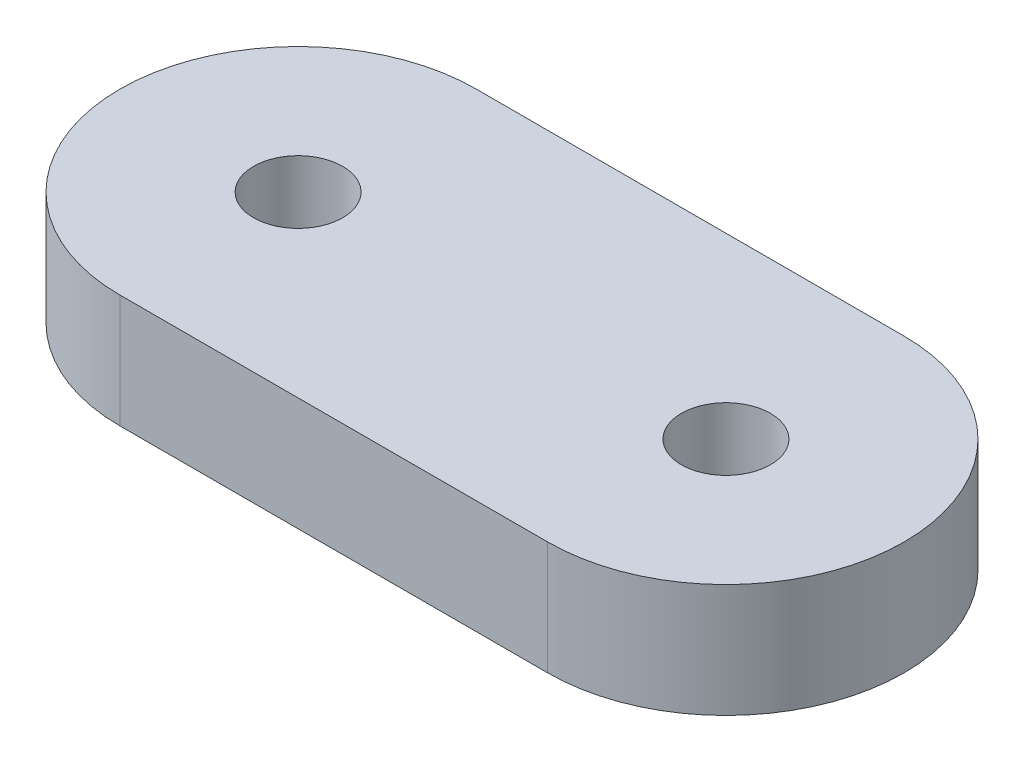
ISO-10303-21;
HEADER;
FILE_DESCRIPTION(('STEP AP214'),'2;1');
FILE_NAME('part.step','',(''),(''),'','','');
FILE_SCHEMA(('AUTOMOTIVE_DESIGN { 1 0 10303 214 1 1 1 1 }'));
ENDSEC;
DATA;
#1=APPLICATION_CONTEXT('core data for automotive mechanical design processes');
#2=APPLICATION_PROTOCOL_DEFINITION('international standard','automotive_design',2000,#1);
#3=PRODUCT_CONTEXT('',#1,'mechanical');
#4=PRODUCT('Part','Part','',(#3));
#5=PRODUCT_RELATED_PRODUCT_CATEGORY('part','',(#4));
#6=PRODUCT_DEFINITION_FORMATION('','',#4);
#7=PRODUCT_DEFINITION_CONTEXT('part definition',#1,'design');
#8=PRODUCT_DEFINITION('design','',#6,#7);
#9=PRODUCT_DEFINITION_SHAPE('','',#8);
#10=(LENGTH_UNIT() NAMED_UNIT(*) SI_UNIT(.MILLI.,.METRE.));
#11=(NAMED_UNIT(*) PLANE_ANGLE_UNIT() SI_UNIT($,.RADIAN.));
#12=(NAMED_UNIT(*) SI_UNIT($,.STERADIAN.) SOLID_ANGLE_UNIT());
#13=UNCERTAINTY_MEASURE_WITH_UNIT(LENGTH_MEASURE(1.E-05),#10,'distance_accuracy_value','');
#14=(GEOMETRIC_REPRESENTATION_CONTEXT(3) GLOBAL_UNCERTAINTY_ASSIGNED_CONTEXT((#13)) GLOBAL_UNIT_ASSIGNED_CONTEXT((#10,
#11,#12)) REPRESENTATION_CONTEXT('',''));
#15=CARTESIAN_POINT('',(0.,0.,0.));
#16=DIRECTION('',(0.,0.,1.));
#17=DIRECTION('',(1.,0.,0.));
#18=AXIS2_PLACEMENT_3D('',#15,#16,#17);
#19=CARTESIAN_POINT('',(0.,3.18,0.));
#20=DIRECTION('',(0.,1.,0.));
#21=DIRECTION('',(0.,0.,1.));
#22=AXIS2_PLACEMENT_3D('',#19,#20,#21);
#23=PLANE('',#22);
#24=CARTESIAN_POINT('',(0.,3.18,0.));
#25=DIRECTION('',(0.,1.,0.));
#26=DIRECTION('',(0.,0.,1.));
#27=AXIS2_PLACEMENT_3D('',#24,#25,#26);
#28=CIRCLE('',#27,1.25);
#29=CARTESIAN_POINT('',(0.,3.18,-1.25));
#30=VERTEX_POINT('',#29);
#31=EDGE_CURVE('E100',#30,#30,#28,.T.);
#32=ORIENTED_EDGE('',*,*,#31,.F.);
#33=EDGE_LOOP('',(#32));
#34=FACE_BOUND('',#33,.T.);
#35=CARTESIAN_POINT('',(0.,3.18,0.));
#36=DIRECTION('',(0.,1.,0.));
#37=DIRECTION('',(0.,0.,1.));
#38=AXIS2_PLACEMENT_3D('',#35,#36,#37);
#39=CIRCLE('',#38,5.);
#40=CARTESIAN_POINT('',(0.,3.18,-5.));
#41=VERTEX_POINT('',#40);
#42=CARTESIAN_POINT('',(0.,3.18,5.));
#43=VERTEX_POINT('',#42);
#44=EDGE_CURVE('E85',#41,#43,#39,.T.);
#45=ORIENTED_EDGE('',*,*,#44,.T.);
#46=DIRECTION('',(1.,0.,0.));
#47=VECTOR('',#46,1.);
#48=CARTESIAN_POINT('',(0.,3.18,5.));
#49=LINE('',#48,#47);
#50=CARTESIAN_POINT('',(12.,3.18,5.));
#51=VERTEX_POINT('',#50);
#52=EDGE_CURVE('E80',#43,#51,#49,.T.);
#53=ORIENTED_EDGE('',*,*,#52,.T.);
#54=CARTESIAN_POINT('',(12.,3.18,0.));
#55=DIRECTION('',(0.,1.,0.));
#56=DIRECTION('',(0.,0.,1.));
#57=AXIS2_PLACEMENT_3D('',#54,#55,#56);
#58=CIRCLE('',#57,5.);
#59=CARTESIAN_POINT('',(12.,3.18,-5.));
#60=VERTEX_POINT('',#59);
#61=EDGE_CURVE('E83',#51,#60,#58,.T.);
#62=ORIENTED_EDGE('',*,*,#61,.T.);
#63=DIRECTION('',(-1.,0.,0.));
#64=VECTOR('',#63,1.);
#65=CARTESIAN_POINT('',(0.,3.18,-5.));
#66=LINE('',#65,#64);
#67=EDGE_CURVE('E50',#60,#41,#66,.T.);
#68=ORIENTED_EDGE('',*,*,#67,.T.);
#69=EDGE_LOOP('',(#45,#53,#62,#68));
#70=FACE_BOUND('',#69,.T.);
#71=CARTESIAN_POINT('',(12.,3.18,0.));
#72=DIRECTION('',(0.,1.,0.));
#73=DIRECTION('',(0.,0.,1.));
#74=AXIS2_PLACEMENT_3D('',#71,#72,#73);
#75=CIRCLE('',#74,1.25);
#76=CARTESIAN_POINT('',(12.,3.18,-1.25));
#77=VERTEX_POINT('',#76);
#78=EDGE_CURVE('E115',#77,#77,#75,.T.);
#79=ORIENTED_EDGE('',*,*,#78,.F.);
#80=EDGE_LOOP('',(#79));
#81=FACE_BOUND('',#80,.T.);
#82=ADVANCED_FACE('F33',(#34,#70,#81),#23,.T.);
#83=CARTESIAN_POINT('',(0.,0.,0.));
#84=DIRECTION('',(0.,1.,0.));
#85=DIRECTION('',(0.,0.,1.));
#86=AXIS2_PLACEMENT_3D('',#83,#84,#85);
#87=PLANE('',#86);
#88=CARTESIAN_POINT('',(0.,0.,0.));
#89=DIRECTION('',(0.,1.,0.));
#90=DIRECTION('',(0.,0.,1.));
#91=AXIS2_PLACEMENT_3D('',#88,#89,#90);
#92=CIRCLE('',#91,5.);
#93=CARTESIAN_POINT('',(0.,0.,-5.));
#94=VERTEX_POINT('',#93);
#95=CARTESIAN_POINT('',(0.,0.,5.));
#96=VERTEX_POINT('',#95);
#97=EDGE_CURVE('E97',#94,#96,#92,.T.);
#98=ORIENTED_EDGE('',*,*,#97,.F.);
#99=DIRECTION('',(-1.,0.,0.));
#100=VECTOR('',#99,1.);
#101=CARTESIAN_POINT('',(0.,0.,-5.));
#102=LINE('',#101,#100);
#103=CARTESIAN_POINT('',(12.,0.,-5.));
#104=VERTEX_POINT('',#103);
#105=EDGE_CURVE('E73',#104,#94,#102,.T.);
#106=ORIENTED_EDGE('',*,*,#105,.F.);
#107=CARTESIAN_POINT('',(12.,0.,0.));
#108=DIRECTION('',(0.,1.,0.));
#109=DIRECTION('',(0.,0.,1.));
#110=AXIS2_PLACEMENT_3D('',#107,#108,#109);
#111=CIRCLE('',#110,5.);
#112=CARTESIAN_POINT('',(12.,0.,5.));
#113=VERTEX_POINT('',#112);
#114=EDGE_CURVE('E67',#113,#104,#111,.T.);
#115=ORIENTED_EDGE('',*,*,#114,.F.);
#116=DIRECTION('',(1.,0.,0.));
#117=VECTOR('',#116,1.);
#118=CARTESIAN_POINT('',(0.,0.,5.));
#119=LINE('',#118,#117);
#120=EDGE_CURVE('E89',#96,#113,#119,.T.);
#121=ORIENTED_EDGE('',*,*,#120,.F.);
#122=EDGE_LOOP('',(#98,#106,#115,#121));
#123=FACE_BOUND('',#122,.T.);
#124=CARTESIAN_POINT('',(0.,0.,0.));
#125=DIRECTION('',(0.,1.,0.));
#126=DIRECTION('',(0.,0.,1.));
#127=AXIS2_PLACEMENT_3D('',#124,#125,#126);
#128=CIRCLE('',#127,1.25);
#129=CARTESIAN_POINT('',(0.,0.,-1.25));
#130=VERTEX_POINT('',#129);
#131=EDGE_CURVE('E112',#130,#130,#128,.T.);
#132=ORIENTED_EDGE('',*,*,#131,.T.);
#133=EDGE_LOOP('',(#132));
#134=FACE_BOUND('',#133,.T.);
#135=CARTESIAN_POINT('',(12.,0.,0.));
#136=DIRECTION('',(0.,1.,0.));
#137=DIRECTION('',(0.,0.,1.));
#138=AXIS2_PLACEMENT_3D('',#135,#136,#137);
#139=CIRCLE('',#138,1.25);
#140=CARTESIAN_POINT('',(12.,0.,-1.25));
#141=VERTEX_POINT('',#140);
#142=EDGE_CURVE('E118',#141,#141,#139,.T.);
#143=ORIENTED_EDGE('',*,*,#142,.T.);
#144=EDGE_LOOP('',(#143));
#145=FACE_BOUND('',#144,.T.);
#146=ADVANCED_FACE('F108',(#123,#134,#145),#87,.F.);
#147=CARTESIAN_POINT('',(0.,3.18,0.));
#148=DIRECTION('',(0.,-1.,0.));
#149=DIRECTION('',(0.,0.,-1.));
#150=AXIS2_PLACEMENT_3D('',#147,#148,#149);
#151=CYLINDRICAL_SURFACE('',#150,5.);
#152=ORIENTED_EDGE('',*,*,#97,.T.);
#153=DIRECTION('',(0.,-1.,0.));
#154=VECTOR('',#153,1.);
#155=CARTESIAN_POINT('',(0.,3.18,5.));
#156=LINE('',#155,#154);
#157=EDGE_CURVE('E11',#43,#96,#156,.T.);
#158=ORIENTED_EDGE('',*,*,#157,.F.);
#159=ORIENTED_EDGE('',*,*,#44,.F.);
#160=DIRECTION('',(0.,-1.,0.));
#161=VECTOR('',#160,1.);
#162=CARTESIAN_POINT('',(0.,3.18,-5.));
#163=LINE('',#162,#161);
#164=EDGE_CURVE('E93',#41,#94,#163,.T.);
#165=ORIENTED_EDGE('',*,*,#164,.T.);
#166=EDGE_LOOP('',(#152,#158,#159,#165));
#167=FACE_BOUND('',#166,.T.);
#168=ADVANCED_FACE('F35',(#167),#151,.T.);
#169=CARTESIAN_POINT('',(0.,3.18,5.));
#170=DIRECTION('',(0.,0.,-1.));
#171=DIRECTION('',(-1.,0.,0.));
#172=AXIS2_PLACEMENT_3D('',#169,#170,#171);
#173=PLANE('',#172);
#174=ORIENTED_EDGE('',*,*,#120,.T.);
#175=DIRECTION('',(0.,-1.,0.));
#176=VECTOR('',#175,1.);
#177=CARTESIAN_POINT('',(12.,3.18,5.));
#178=LINE('',#177,#176);
#179=EDGE_CURVE('E42',#51,#113,#178,.T.);
#180=ORIENTED_EDGE('',*,*,#179,.F.);
#181=ORIENTED_EDGE('',*,*,#52,.F.);
#182=ORIENTED_EDGE('',*,*,#157,.T.);
#183=EDGE_LOOP('',(#174,#180,#181,#182));
#184=FACE_BOUND('',#183,.T.);
#185=ADVANCED_FACE('F88',(#184),#173,.F.);
#186=CARTESIAN_POINT('',(12.,3.18,0.));
#187=DIRECTION('',(0.,-1.,0.));
#188=DIRECTION('',(0.,0.,-1.));
#189=AXIS2_PLACEMENT_3D('',#186,#187,#188);
#190=CYLINDRICAL_SURFACE('',#189,5.);
#191=ORIENTED_EDGE('',*,*,#114,.T.);
#192=DIRECTION('',(0.,-1.,0.));
#193=VECTOR('',#192,1.);
#194=CARTESIAN_POINT('',(12.,3.18,-5.));
#195=LINE('',#194,#193);
#196=EDGE_CURVE('E90',#60,#104,#195,.T.);
#197=ORIENTED_EDGE('',*,*,#196,.F.);
#198=ORIENTED_EDGE('',*,*,#61,.F.);
#199=ORIENTED_EDGE('',*,*,#179,.T.);
#200=EDGE_LOOP('',(#191,#197,#198,#199));
#201=FACE_BOUND('',#200,.T.);
#202=ADVANCED_FACE('F91',(#201),#190,.T.);
#203=CARTESIAN_POINT('',(0.,3.18,-5.));
#204=DIRECTION('',(0.,0.,1.));
#205=DIRECTION('',(1.,0.,0.));
#206=AXIS2_PLACEMENT_3D('',#203,#204,#205);
#207=PLANE('',#206);
#208=ORIENTED_EDGE('',*,*,#105,.T.);
#209=ORIENTED_EDGE('',*,*,#164,.F.);
#210=ORIENTED_EDGE('',*,*,#67,.F.);
#211=ORIENTED_EDGE('',*,*,#196,.T.);
#212=EDGE_LOOP('',(#208,#209,#210,#211));
#213=FACE_BOUND('',#212,.T.);
#214=ADVANCED_FACE('F105',(#213),#207,.F.);
#215=CARTESIAN_POINT('',(0.,3.18,0.));
#216=DIRECTION('',(0.,-1.,0.));
#217=DIRECTION('',(0.,0.,-1.));
#218=AXIS2_PLACEMENT_3D('',#215,#216,#217);
#219=CYLINDRICAL_SURFACE('',#218,1.25);
#220=CARTESIAN_POINT('',(0.,3.18,-1.25));
#221=CARTESIAN_POINT('',(0.,3.146875,-1.25));
#222=CARTESIAN_POINT('',(0.,3.11375,-1.25));
#223=CARTESIAN_POINT('',(0.,3.0475,-1.25));
#224=CARTESIAN_POINT('',(0.,3.014375,-1.25));
#225=CARTESIAN_POINT('',(0.,2.948125,-1.25));
#226=CARTESIAN_POINT('',(0.,2.915,-1.25));
#227=CARTESIAN_POINT('',(0.,2.84875,-1.25));
#228=CARTESIAN_POINT('',(0.,2.815625,-1.25));
#229=CARTESIAN_POINT('',(0.,2.749375,-1.25));
#230=CARTESIAN_POINT('',(0.,2.71625,-1.25));
#231=CARTESIAN_POINT('',(0.,2.65,-1.25));
#232=CARTESIAN_POINT('',(0.,2.616875,-1.25));
#233=CARTESIAN_POINT('',(0.,2.550625,-1.25));
#234=CARTESIAN_POINT('',(0.,2.5175,-1.25));
#235=CARTESIAN_POINT('',(0.,2.45125,-1.25));
#236=CARTESIAN_POINT('',(0.,2.418125,-1.25));
#237=CARTESIAN_POINT('',(0.,2.351875,-1.25));
#238=CARTESIAN_POINT('',(0.,2.31875,-1.25));
#239=CARTESIAN_POINT('',(0.,2.2525,-1.25));
#240=CARTESIAN_POINT('',(0.,2.219375,-1.25));
#241=CARTESIAN_POINT('',(0.,2.153125,-1.25));
#242=CARTESIAN_POINT('',(0.,2.12,-1.25));
#243=CARTESIAN_POINT('',(0.,2.05375,-1.25));
#244=CARTESIAN_POINT('',(0.,2.020625,-1.25));
#245=CARTESIAN_POINT('',(0.,1.954375,-1.25));
#246=CARTESIAN_POINT('',(0.,1.92125,-1.25));
#247=CARTESIAN_POINT('',(0.,1.855,-1.25));
#248=CARTESIAN_POINT('',(0.,1.821875,-1.25));
#249=CARTESIAN_POINT('',(0.,1.755625,-1.25));
#250=CARTESIAN_POINT('',(0.,1.7225,-1.25));
#251=CARTESIAN_POINT('',(0.,1.65625,-1.25));
#252=CARTESIAN_POINT('',(0.,1.623125,-1.25));
#253=CARTESIAN_POINT('',(0.,1.556875,-1.25));
#254=CARTESIAN_POINT('',(0.,1.52375,-1.25));
#255=CARTESIAN_POINT('',(0.,1.4575,-1.25));
#256=CARTESIAN_POINT('',(0.,1.424375,-1.25));
#257=CARTESIAN_POINT('',(0.,1.358125,-1.25));
#258=CARTESIAN_POINT('',(0.,1.325,-1.25));
#259=CARTESIAN_POINT('',(0.,1.25875,-1.25));
#260=CARTESIAN_POINT('',(0.,1.225625,-1.25));
#261=CARTESIAN_POINT('',(0.,1.159375,-1.25));
#262=CARTESIAN_POINT('',(0.,1.12625,-1.25));
#263=CARTESIAN_POINT('',(0.,1.06,-1.25));
#264=CARTESIAN_POINT('',(0.,1.026875,-1.25));
#265=CARTESIAN_POINT('',(0.,0.960625,-1.25));
#266=CARTESIAN_POINT('',(0.,0.9275,-1.25));
#267=CARTESIAN_POINT('',(0.,0.86125,-1.25));
#268=CARTESIAN_POINT('',(0.,0.828125,-1.25));
#269=CARTESIAN_POINT('',(0.,0.761875,-1.25));
#270=CARTESIAN_POINT('',(0.,0.72875,-1.25));
#271=CARTESIAN_POINT('',(0.,0.6625,-1.25));
#272=CARTESIAN_POINT('',(0.,0.629375,-1.25));
#273=CARTESIAN_POINT('',(0.,0.563125,-1.25));
#274=CARTESIAN_POINT('',(0.,0.53,-1.25));
#275=CARTESIAN_POINT('',(0.,0.46375,-1.25));
#276=CARTESIAN_POINT('',(0.,0.430625,-1.25));
#277=CARTESIAN_POINT('',(0.,0.364375,-1.25));
#278=CARTESIAN_POINT('',(0.,0.33125,-1.25));
#279=CARTESIAN_POINT('',(0.,0.265,-1.25));
#280=CARTESIAN_POINT('',(0.,0.231875,-1.25));
#281=CARTESIAN_POINT('',(0.,0.165625,-1.25));
#282=CARTESIAN_POINT('',(0.,0.1325,-1.25));
#283=CARTESIAN_POINT('',(0.,0.06625,-1.25));
#284=CARTESIAN_POINT('',(0.,0.033125,-1.25));
#285=CARTESIAN_POINT('',(0.,0.,-1.25));
#286=B_SPLINE_CURVE_WITH_KNOTS('',3,(#220,#221,#222,#223,#224,#225,#226,#227,#228,#229,#230,
#231,#232,#233,#234,#235,#236,#237,#238,#239,#240,#241,#242,#243,#244,#245,#246,#247,#248,#249,
#250,#251,#252,#253,#254,#255,#256,#257,#258,#259,#260,#261,#262,#263,#264,#265,#266,#267,#268,
#269,#270,#271,#272,#273,#274,#275,#276,#277,#278,#279,#280,#281,#282,#283,#284,#285),
.UNSPECIFIED.,.F.,.F.,(4,2,2,2,2,2,2,2,2,2,2,2,2,2,2,2,2,2,2,2,2,2,2,2,2,2,2,2,2,2,2,2,4),(0.,
0.0993750000000001,0.19875,0.298125,0.3975,0.496875,0.59625,0.695625,0.795,0.894375,0.99375,
1.093125,1.1925,1.291875,1.39125,1.490625,1.59,1.689375,1.78875,1.888125,1.9875,2.086875,
2.18625,2.285625,2.385,2.484375,2.58375,2.683125,2.7825,2.881875,2.98125,3.080625,3.18),.UNSPECIFIED.);
#287=EDGE_CURVE('BSEAM135',#30,#130,#286,.T.);
#288=ORIENTED_EDGE('',*,*,#31,.T.);
#289=ORIENTED_EDGE('',*,*,#131,.F.);
#290=ORIENTED_EDGE('',*,*,#287,.T.);
#291=ORIENTED_EDGE('',*,*,#287,.F.);
#292=EDGE_LOOP('',(#288,#290,#289,#291));
#293=FACE_BOUND('',#292,.T.);
#294=ADVANCED_FACE('F135',(#293),#219,.F.);
#295=CARTESIAN_POINT('',(12.,3.18,0.));
#296=DIRECTION('',(0.,-1.,0.));
#297=DIRECTION('',(0.,0.,-1.));
#298=AXIS2_PLACEMENT_3D('',#295,#296,#297);
#299=CYLINDRICAL_SURFACE('',#298,1.25);
#300=CARTESIAN_POINT('',(12.,3.18,-1.25));
#301=CARTESIAN_POINT('',(12.,3.146875,-1.25));
#302=CARTESIAN_POINT('',(12.,3.11375,-1.25));
#303=CARTESIAN_POINT('',(12.,3.0475,-1.25));
#304=CARTESIAN_POINT('',(12.,3.014375,-1.25));
#305=CARTESIAN_POINT('',(12.,2.948125,-1.25));
#306=CARTESIAN_POINT('',(12.,2.915,-1.25));
#307=CARTESIAN_POINT('',(12.,2.84875,-1.25));
#308=CARTESIAN_POINT('',(12.,2.815625,-1.25));
#309=CARTESIAN_POINT('',(12.,2.749375,-1.25));
#310=CARTESIAN_POINT('',(12.,2.71625,-1.25));
#311=CARTESIAN_POINT('',(12.,2.65,-1.25));
#312=CARTESIAN_POINT('',(12.,2.616875,-1.25));
#313=CARTESIAN_POINT('',(12.,2.550625,-1.25));
#314=CARTESIAN_POINT('',(12.,2.5175,-1.25));
#315=CARTESIAN_POINT('',(12.,2.45125,-1.25));
#316=CARTESIAN_POINT('',(12.,2.418125,-1.25));
#317=CARTESIAN_POINT('',(12.,2.351875,-1.25));
#318=CARTESIAN_POINT('',(12.,2.31875,-1.25));
#319=CARTESIAN_POINT('',(12.,2.2525,-1.25));
#320=CARTESIAN_POINT('',(12.,2.219375,-1.25));
#321=CARTESIAN_POINT('',(12.,2.153125,-1.25));
#322=CARTESIAN_POINT('',(12.,2.12,-1.25));
#323=CARTESIAN_POINT('',(12.,2.05375,-1.25));
#324=CARTESIAN_POINT('',(12.,2.020625,-1.25));
#325=CARTESIAN_POINT('',(12.,1.954375,-1.25));
#326=CARTESIAN_POINT('',(12.,1.92125,-1.25));
#327=CARTESIAN_POINT('',(12.,1.855,-1.25));
#328=CARTESIAN_POINT('',(12.,1.821875,-1.25));
#329=CARTESIAN_POINT('',(12.,1.755625,-1.25));
#330=CARTESIAN_POINT('',(12.,1.7225,-1.25));
#331=CARTESIAN_POINT('',(12.,1.65625,-1.25));
#332=CARTESIAN_POINT('',(12.,1.623125,-1.25));
#333=CARTESIAN_POINT('',(12.,1.556875,-1.25));
#334=CARTESIAN_POINT('',(12.,1.52375,-1.25));
#335=CARTESIAN_POINT('',(12.,1.4575,-1.25));
#336=CARTESIAN_POINT('',(12.,1.424375,-1.25));
#337=CARTESIAN_POINT('',(12.,1.358125,-1.25));
#338=CARTESIAN_POINT('',(12.,1.325,-1.25));
#339=CARTESIAN_POINT('',(12.,1.25875,-1.25));
#340=CARTESIAN_POINT('',(12.,1.225625,-1.25));
#341=CARTESIAN_POINT('',(12.,1.159375,-1.25));
#342=CARTESIAN_POINT('',(12.,1.12625,-1.25));
#343=CARTESIAN_POINT('',(12.,1.06,-1.25));
#344=CARTESIAN_POINT('',(12.,1.026875,-1.25));
#345=CARTESIAN_POINT('',(12.,0.960625,-1.25));
#346=CARTESIAN_POINT('',(12.,0.9275,-1.25));
#347=CARTESIAN_POINT('',(12.,0.86125,-1.25));
#348=CARTESIAN_POINT('',(12.,0.828125,-1.25));
#349=CARTESIAN_POINT('',(12.,0.761875,-1.25));
#350=CARTESIAN_POINT('',(12.,0.72875,-1.25));
#351=CARTESIAN_POINT('',(12.,0.6625,-1.25));
#352=CARTESIAN_POINT('',(12.,0.629375,-1.25));
#353=CARTESIAN_POINT('',(12.,0.563125,-1.25));
#354=CARTESIAN_POINT('',(12.,0.53,-1.25));
#355=CARTESIAN_POINT('',(12.,0.46375,-1.25));
#356=CARTESIAN_POINT('',(12.,0.430625,-1.25));
#357=CARTESIAN_POINT('',(12.,0.364375,-1.25));
#358=CARTESIAN_POINT('',(12.,0.33125,-1.25));
#359=CARTESIAN_POINT('',(12.,0.265,-1.25));
#360=CARTESIAN_POINT('',(12.,0.231875,-1.25));
#361=CARTESIAN_POINT('',(12.,0.165625,-1.25));
#362=CARTESIAN_POINT('',(12.,0.1325,-1.25));
#363=CARTESIAN_POINT('',(12.,0.06625,-1.25));
#364=CARTESIAN_POINT('',(12.,0.033125,-1.25));
#365=CARTESIAN_POINT('',(12.,0.,-1.25));
#366=B_SPLINE_CURVE_WITH_KNOTS('',3,(#300,#301,#302,#303,#304,#305,#306,#307,#308,#309,#310,
#311,#312,#313,#314,#315,#316,#317,#318,#319,#320,#321,#322,#323,#324,#325,#326,#327,#328,#329,
#330,#331,#332,#333,#334,#335,#336,#337,#338,#339,#340,#341,#342,#343,#344,#345,#346,#347,#348,
#349,#350,#351,#352,#353,#354,#355,#356,#357,#358,#359,#360,#361,#362,#363,#364,#365),
.UNSPECIFIED.,.F.,.F.,(4,2,2,2,2,2,2,2,2,2,2,2,2,2,2,2,2,2,2,2,2,2,2,2,2,2,2,2,2,2,2,2,4),(0.,
0.0993750000000001,0.19875,0.298125,0.3975,0.496875,0.59625,0.695625,0.795,0.894375,0.99375,
1.093125,1.1925,1.291875,1.39125,1.490625,1.59,1.689375,1.78875,1.888125,1.9875,2.086875,
2.18625,2.285625,2.385,2.484375,2.58375,2.683125,2.7825,2.881875,2.98125,3.080625,3.18),.UNSPECIFIED.);
#367=EDGE_CURVE('BSEAM124',#77,#141,#366,.T.);
#368=ORIENTED_EDGE('',*,*,#78,.T.);
#369=ORIENTED_EDGE('',*,*,#142,.F.);
#370=ORIENTED_EDGE('',*,*,#367,.T.);
#371=ORIENTED_EDGE('',*,*,#367,.F.);
#372=EDGE_LOOP('',(#368,#370,#369,#371));
#373=FACE_BOUND('',#372,.T.);
#374=ADVANCED_FACE('F124',(#373),#299,.F.);
#375=CLOSED_SHELL('',(#82,#146,#168,#185,#202,#214,#294,#374));
#376=MANIFOLD_SOLID_BREP('B2',#375);
#377=ADVANCED_BREP_SHAPE_REPRESENTATION('',(#18,#376),#14);
#378=SHAPE_DEFINITION_REPRESENTATION(#9,#377);
ENDSEC;
END-ISO-10303-21;
